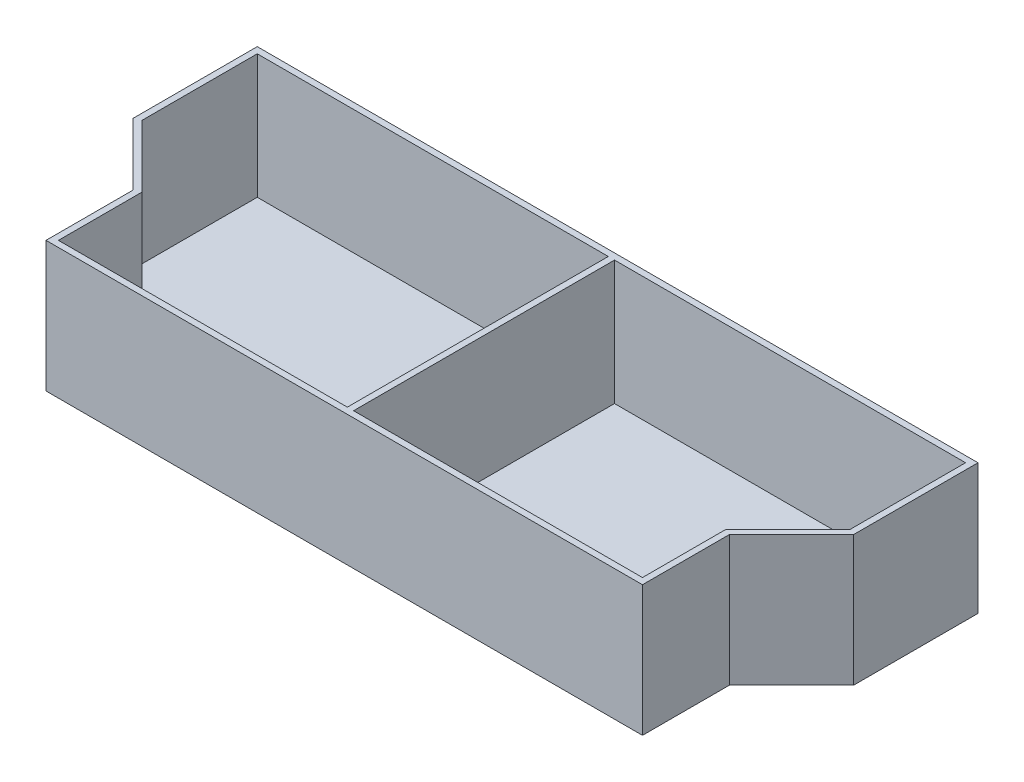
ISO-10303-21;
HEADER;
FILE_DESCRIPTION(('STEP AP214'),'2;1');
FILE_NAME('part.step','',(''),(''),'','','');
FILE_SCHEMA(('AUTOMOTIVE_DESIGN { 1 0 10303 214 1 1 1 1 }'));
ENDSEC;
DATA;
#1=APPLICATION_CONTEXT('core data for automotive mechanical design processes');
#2=APPLICATION_PROTOCOL_DEFINITION('international standard','automotive_design',2000,#1);
#3=PRODUCT_CONTEXT('',#1,'mechanical');
#4=PRODUCT('Part','Part','',(#3));
#5=PRODUCT_RELATED_PRODUCT_CATEGORY('part','',(#4));
#6=PRODUCT_DEFINITION_FORMATION('','',#4);
#7=PRODUCT_DEFINITION_CONTEXT('part definition',#1,'design');
#8=PRODUCT_DEFINITION('design','',#6,#7);
#9=PRODUCT_DEFINITION_SHAPE('','',#8);
#10=(LENGTH_UNIT() NAMED_UNIT(*) SI_UNIT(.MILLI.,.METRE.));
#11=(NAMED_UNIT(*) PLANE_ANGLE_UNIT() SI_UNIT($,.RADIAN.));
#12=(NAMED_UNIT(*) SI_UNIT($,.STERADIAN.) SOLID_ANGLE_UNIT());
#13=UNCERTAINTY_MEASURE_WITH_UNIT(LENGTH_MEASURE(1.E-05),#10,'distance_accuracy_value','');
#14=(GEOMETRIC_REPRESENTATION_CONTEXT(3) GLOBAL_UNCERTAINTY_ASSIGNED_CONTEXT((#13)) GLOBAL_UNIT_ASSIGNED_CONTEXT((#10,
#11,#12)) REPRESENTATION_CONTEXT('',''));
#15=CARTESIAN_POINT('',(0.,0.,0.));
#16=DIRECTION('',(0.,0.,1.));
#17=DIRECTION('',(1.,0.,0.));
#18=AXIS2_PLACEMENT_3D('',#15,#16,#17);
#19=CARTESIAN_POINT('',(596.9,254.,-12.7));
#20=DIRECTION('',(0.,0.,-1.));
#21=DIRECTION('',(-1.,0.,0.));
#22=AXIS2_PLACEMENT_3D('',#19,#20,#21);
#23=PLANE('',#22);
#24=DIRECTION('',(1.,0.,0.));
#25=VECTOR('',#24,1.);
#26=CARTESIAN_POINT('',(0.,254.,-12.7));
#27=LINE('',#26,#25);
#28=CARTESIAN_POINT('',(-596.9,254.,-12.6999999999999));
#29=VERTEX_POINT('',#28);
#30=CARTESIAN_POINT('',(-6.34999999999997,254.,-12.7));
#31=VERTEX_POINT('',#30);
#32=EDGE_CURVE('E55',#29,#31,#27,.T.);
#33=ORIENTED_EDGE('',*,*,#32,.T.);
#34=DIRECTION('',(0.,-1.,0.));
#35=VECTOR('',#34,1.);
#36=CARTESIAN_POINT('',(-6.34999999999995,787.55116905504,-12.7));
#37=LINE('',#36,#35);
#38=CARTESIAN_POINT('',(-6.34999999999997,0.,-12.7));
#39=VERTEX_POINT('',#38);
#40=EDGE_CURVE('E197',#31,#39,#37,.T.);
#41=ORIENTED_EDGE('',*,*,#40,.T.);
#42=DIRECTION('',(1.,0.,0.));
#43=VECTOR('',#42,1.);
#44=CARTESIAN_POINT('',(596.9,0.,-12.7));
#45=LINE('',#44,#43);
#46=CARTESIAN_POINT('',(-596.9,0.,-12.6999999999999));
#47=VERTEX_POINT('',#46);
#48=EDGE_CURVE('E257',#47,#39,#45,.T.);
#49=ORIENTED_EDGE('',*,*,#48,.F.);
#50=DIRECTION('',(0.,-1.,0.));
#51=VECTOR('',#50,1.);
#52=CARTESIAN_POINT('',(-596.9,254.,-12.6999999999999));
#53=LINE('',#52,#51);
#54=EDGE_CURVE('E281',#29,#47,#53,.T.);
#55=ORIENTED_EDGE('',*,*,#54,.F.);
#56=EDGE_LOOP('',(#33,#41,#49,#55));
#57=FACE_BOUND('',#56,.T.);
#58=ADVANCED_FACE('F32',(#57),#23,.T.);
#59=CARTESIAN_POINT('',(6.35000000000008,0.,-12.7));
#60=VERTEX_POINT('',#59);
#61=CARTESIAN_POINT('',(596.9,0.,-12.7));
#62=VERTEX_POINT('',#61);
#63=EDGE_CURVE('E256',#60,#62,#45,.T.);
#64=ORIENTED_EDGE('',*,*,#63,.F.);
#65=DIRECTION('',(0.,-1.,0.));
#66=VECTOR('',#65,1.);
#67=CARTESIAN_POINT('',(6.35000000000005,787.55116905504,-12.7));
#68=LINE('',#67,#66);
#69=CARTESIAN_POINT('',(6.35000000000008,254.,-12.7));
#70=VERTEX_POINT('',#69);
#71=EDGE_CURVE('E47',#70,#60,#68,.T.);
#72=ORIENTED_EDGE('',*,*,#71,.F.);
#73=CARTESIAN_POINT('',(596.9,254.,-12.7));
#74=VERTEX_POINT('',#73);
#75=EDGE_CURVE('E238',#70,#74,#27,.T.);
#76=ORIENTED_EDGE('',*,*,#75,.T.);
#77=DIRECTION('',(0.,-1.,0.));
#78=VECTOR('',#77,1.);
#79=CARTESIAN_POINT('',(596.9,254.,-12.7));
#80=LINE('',#79,#78);
#81=EDGE_CURVE('E278',#74,#62,#80,.T.);
#82=ORIENTED_EDGE('',*,*,#81,.T.);
#83=EDGE_LOOP('',(#64,#72,#76,#82));
#84=FACE_BOUND('',#83,.T.);
#85=ADVANCED_FACE('F367',(#84),#23,.T.);
#86=CARTESIAN_POINT('',(-723.900000000001,254.,-546.1));
#87=DIRECTION('',(0.,0.,1.));
#88=DIRECTION('',(1.,0.,0.));
#89=AXIS2_PLACEMENT_3D('',#86,#87,#88);
#90=PLANE('',#89);
#91=DIRECTION('',(-1.,0.,0.));
#92=VECTOR('',#91,1.);
#93=CARTESIAN_POINT('',(-723.900000000001,0.,-546.1));
#94=LINE('',#93,#92);
#95=CARTESIAN_POINT('',(-6.34999999999997,0.,-546.1));
#96=VERTEX_POINT('',#95);
#97=CARTESIAN_POINT('',(-723.900000000001,0.,-546.1));
#98=VERTEX_POINT('',#97);
#99=EDGE_CURVE('E181',#96,#98,#94,.T.);
#100=ORIENTED_EDGE('',*,*,#99,.F.);
#101=DIRECTION('',(0.,-1.,0.));
#102=VECTOR('',#101,1.);
#103=CARTESIAN_POINT('',(-6.34999999999991,787.55116905504,-546.1));
#104=LINE('',#103,#102);
#105=CARTESIAN_POINT('',(-6.34999999999997,254.,-546.1));
#106=VERTEX_POINT('',#105);
#107=EDGE_CURVE('E191',#106,#96,#104,.T.);
#108=ORIENTED_EDGE('',*,*,#107,.F.);
#109=DIRECTION('',(-1.,0.,0.));
#110=VECTOR('',#109,1.);
#111=CARTESIAN_POINT('',(-723.900000000001,254.,-546.1));
#112=LINE('',#111,#110);
#113=CARTESIAN_POINT('',(-723.900000000001,254.,-546.1));
#114=VERTEX_POINT('',#113);
#115=EDGE_CURVE('E246',#106,#114,#112,.T.);
#116=ORIENTED_EDGE('',*,*,#115,.T.);
#117=DIRECTION('',(0.,-1.,0.));
#118=VECTOR('',#117,1.);
#119=CARTESIAN_POINT('',(-723.900000000001,254.,-546.1));
#120=LINE('',#119,#118);
#121=EDGE_CURVE('E269',#114,#98,#120,.T.);
#122=ORIENTED_EDGE('',*,*,#121,.T.);
#123=EDGE_LOOP('',(#100,#108,#116,#122));
#124=FACE_BOUND('',#123,.T.);
#125=ADVANCED_FACE('F372',(#124),#90,.T.);
#126=CARTESIAN_POINT('',(723.9,254.,-546.1));
#127=VERTEX_POINT('',#126);
#128=CARTESIAN_POINT('',(6.35000000000008,254.,-546.1));
#129=VERTEX_POINT('',#128);
#130=EDGE_CURVE('E187',#127,#129,#112,.T.);
#131=ORIENTED_EDGE('',*,*,#130,.T.);
#132=DIRECTION('',(0.,-1.,0.));
#133=VECTOR('',#132,1.);
#134=CARTESIAN_POINT('',(6.35000000000009,787.55116905504,-546.1));
#135=LINE('',#134,#133);
#136=CARTESIAN_POINT('',(6.35000000000009,0.,-546.1));
#137=VERTEX_POINT('',#136);
#138=EDGE_CURVE('E184',#129,#137,#135,.T.);
#139=ORIENTED_EDGE('',*,*,#138,.T.);
#140=CARTESIAN_POINT('',(723.9,0.,-546.1));
#141=VERTEX_POINT('',#140);
#142=EDGE_CURVE('E170',#141,#137,#94,.T.);
#143=ORIENTED_EDGE('',*,*,#142,.F.);
#144=DIRECTION('',(0.,-1.,0.));
#145=VECTOR('',#144,1.);
#146=CARTESIAN_POINT('',(723.9,254.,-546.1));
#147=LINE('',#146,#145);
#148=EDGE_CURVE('E272',#127,#141,#147,.T.);
#149=ORIENTED_EDGE('',*,*,#148,.F.);
#150=EDGE_LOOP('',(#131,#139,#143,#149));
#151=FACE_BOUND('',#150,.T.);
#152=ADVANCED_FACE('F185',(#151),#90,.T.);
#153=CARTESIAN_POINT('',(0.,0.,0.));
#154=DIRECTION('',(0.,-1.,0.));
#155=DIRECTION('',(0.,0.,-1.));
#156=AXIS2_PLACEMENT_3D('',#153,#154,#155);
#157=PLANE('',#156);
#158=DIRECTION('',(0.,0.,1.));
#159=VECTOR('',#158,1.);
#160=CARTESIAN_POINT('',(-6.34999999999995,0.,-12.7));
#161=LINE('',#160,#159);
#162=EDGE_CURVE('E194',#96,#39,#161,.T.);
#163=ORIENTED_EDGE('',*,*,#162,.F.);
#164=ORIENTED_EDGE('',*,*,#99,.T.);
#165=DIRECTION('',(0.,0.,1.));
#166=VECTOR('',#165,1.);
#167=CARTESIAN_POINT('',(-723.900000000001,0.,-310.060512242138));
#168=LINE('',#167,#166);
#169=CARTESIAN_POINT('',(-723.900000000001,0.,-310.060512242138));
#170=VERTEX_POINT('',#169);
#171=EDGE_CURVE('E180',#98,#170,#168,.T.);
#172=ORIENTED_EDGE('',*,*,#171,.T.);
#173=DIRECTION('',(0.70710678118655,0.,0.707106781186545));
#174=VECTOR('',#173,1.);
#175=CARTESIAN_POINT('',(-596.9,0.,-183.060512242138));
#176=LINE('',#175,#174);
#177=CARTESIAN_POINT('',(-596.9,0.,-183.060512242138));
#178=VERTEX_POINT('',#177);
#179=EDGE_CURVE('E233',#170,#178,#176,.T.);
#180=ORIENTED_EDGE('',*,*,#179,.T.);
#181=DIRECTION('',(0.,0.,1.));
#182=VECTOR('',#181,1.);
#183=CARTESIAN_POINT('',(-596.9,0.,-12.6999999999999));
#184=LINE('',#183,#182);
#185=EDGE_CURVE('E253',#178,#47,#184,.T.);
#186=ORIENTED_EDGE('',*,*,#185,.T.);
#187=ORIENTED_EDGE('',*,*,#48,.T.);
#188=EDGE_LOOP('',(#163,#164,#172,#180,#186,#187));
#189=FACE_BOUND('',#188,.T.);
#190=ADVANCED_FACE('F506',(#189),#157,.F.);
#191=DIRECTION('',(0.,0.,-1.));
#192=VECTOR('',#191,1.);
#193=CARTESIAN_POINT('',(6.35000000000005,0.,-12.7));
#194=LINE('',#193,#192);
#195=EDGE_CURVE('E174',#60,#137,#194,.T.);
#196=ORIENTED_EDGE('',*,*,#195,.F.);
#197=ORIENTED_EDGE('',*,*,#63,.T.);
#198=DIRECTION('',(0.,0.,-1.));
#199=VECTOR('',#198,1.);
#200=CARTESIAN_POINT('',(596.9,0.,-183.060512242138));
#201=LINE('',#200,#199);
#202=CARTESIAN_POINT('',(596.9,0.,-183.060512242138));
#203=VERTEX_POINT('',#202);
#204=EDGE_CURVE('E260',#62,#203,#201,.T.);
#205=ORIENTED_EDGE('',*,*,#204,.T.);
#206=DIRECTION('',(0.707106781186545,0.,-0.70710678118655));
#207=VECTOR('',#206,1.);
#208=CARTESIAN_POINT('',(723.9,0.,-310.060512242138));
#209=LINE('',#208,#207);
#210=CARTESIAN_POINT('',(723.9,0.,-310.060512242138));
#211=VERTEX_POINT('',#210);
#212=EDGE_CURVE('E263',#203,#211,#209,.T.);
#213=ORIENTED_EDGE('',*,*,#212,.T.);
#214=DIRECTION('',(0.,0.,-1.));
#215=VECTOR('',#214,1.);
#216=CARTESIAN_POINT('',(723.9,0.,-546.1));
#217=LINE('',#216,#215);
#218=EDGE_CURVE('E177',#211,#141,#217,.T.);
#219=ORIENTED_EDGE('',*,*,#218,.T.);
#220=ORIENTED_EDGE('',*,*,#142,.T.);
#221=EDGE_LOOP('',(#196,#197,#205,#213,#219,#220));
#222=FACE_BOUND('',#221,.T.);
#223=ADVANCED_FACE('F172',(#222),#157,.F.);
#224=CARTESIAN_POINT('',(0.,254.,0.));
#225=DIRECTION('',(0.,-1.,0.));
#226=DIRECTION('',(0.,0.,-1.));
#227=AXIS2_PLACEMENT_3D('',#224,#225,#226);
#228=PLANE('',#227);
#229=DIRECTION('',(0.,0.,-1.));
#230=VECTOR('',#229,1.);
#231=CARTESIAN_POINT('',(-6.34999999999995,254.,-12.7));
#232=LINE('',#231,#230);
#233=EDGE_CURVE('E206',#31,#106,#232,.T.);
#234=ORIENTED_EDGE('',*,*,#233,.F.);
#235=ORIENTED_EDGE('',*,*,#32,.F.);
#236=DIRECTION('',(0.,0.,1.));
#237=VECTOR('',#236,1.);
#238=CARTESIAN_POINT('',(-596.9,254.,-12.6999999999999));
#239=LINE('',#238,#237);
#240=CARTESIAN_POINT('',(-596.9,254.,-183.060512242138));
#241=VERTEX_POINT('',#240);
#242=EDGE_CURVE('E236',#241,#29,#239,.T.);
#243=ORIENTED_EDGE('',*,*,#242,.F.);
#244=DIRECTION('',(0.70710678118655,0.,0.707106781186545));
#245=VECTOR('',#244,1.);
#246=CARTESIAN_POINT('',(-596.9,254.,-183.060512242138));
#247=LINE('',#246,#245);
#248=CARTESIAN_POINT('',(-723.900000000001,254.,-310.060512242138));
#249=VERTEX_POINT('',#248);
#250=EDGE_CURVE('E234',#249,#241,#247,.T.);
#251=ORIENTED_EDGE('',*,*,#250,.F.);
#252=DIRECTION('',(0.,0.,1.));
#253=VECTOR('',#252,1.);
#254=CARTESIAN_POINT('',(-723.900000000001,254.,-310.060512242138));
#255=LINE('',#254,#253);
#256=EDGE_CURVE('E248',#114,#249,#255,.T.);
#257=ORIENTED_EDGE('',*,*,#256,.F.);
#258=ORIENTED_EDGE('',*,*,#115,.F.);
#259=EDGE_LOOP('',(#234,#235,#243,#251,#257,#258));
#260=FACE_BOUND('',#259,.T.);
#261=DIRECTION('',(1.,0.,0.));
#262=VECTOR('',#261,1.);
#263=CARTESIAN_POINT('',(609.6,254.,0.));
#264=LINE('',#263,#262);
#265=CARTESIAN_POINT('',(-609.6,254.,0.));
#266=VERTEX_POINT('',#265);
#267=CARTESIAN_POINT('',(609.6,254.,0.));
#268=VERTEX_POINT('',#267);
#269=EDGE_CURVE('E287',#266,#268,#264,.T.);
#270=ORIENTED_EDGE('',*,*,#269,.T.);
#271=DIRECTION('',(0.,0.,-1.));
#272=VECTOR('',#271,1.);
#273=CARTESIAN_POINT('',(609.6,254.,-177.799999999999));
#274=LINE('',#273,#272);
#275=CARTESIAN_POINT('',(609.6,254.,-177.799999999999));
#276=VERTEX_POINT('',#275);
#277=EDGE_CURVE('E290',#268,#276,#274,.T.);
#278=ORIENTED_EDGE('',*,*,#277,.T.);
#279=DIRECTION('',(0.707106781186545,0.,-0.70710678118655));
#280=VECTOR('',#279,1.);
#281=CARTESIAN_POINT('',(736.599999999999,254.,-304.8));
#282=LINE('',#281,#280);
#283=CARTESIAN_POINT('',(736.599999999999,254.,-304.8));
#284=VERTEX_POINT('',#283);
#285=EDGE_CURVE('E292',#276,#284,#282,.T.);
#286=ORIENTED_EDGE('',*,*,#285,.T.);
#287=DIRECTION('',(0.,0.,-1.));
#288=VECTOR('',#287,1.);
#289=CARTESIAN_POINT('',(736.6,254.,-558.8));
#290=LINE('',#289,#288);
#291=CARTESIAN_POINT('',(736.6,254.,-558.8));
#292=VERTEX_POINT('',#291);
#293=EDGE_CURVE('E294',#284,#292,#290,.T.);
#294=ORIENTED_EDGE('',*,*,#293,.T.);
#295=DIRECTION('',(-1.,0.,0.));
#296=VECTOR('',#295,1.);
#297=CARTESIAN_POINT('',(-736.600000000001,254.,-558.8));
#298=LINE('',#297,#296);
#299=CARTESIAN_POINT('',(-736.600000000001,254.,-558.8));
#300=VERTEX_POINT('',#299);
#301=EDGE_CURVE('E296',#292,#300,#298,.T.);
#302=ORIENTED_EDGE('',*,*,#301,.T.);
#303=DIRECTION('',(0.,0.,1.));
#304=VECTOR('',#303,1.);
#305=CARTESIAN_POINT('',(-736.600000000001,254.,-304.799999999999));
#306=LINE('',#305,#304);
#307=CARTESIAN_POINT('',(-736.600000000001,254.,-304.799999999999));
#308=VERTEX_POINT('',#307);
#309=EDGE_CURVE('E298',#300,#308,#306,.T.);
#310=ORIENTED_EDGE('',*,*,#309,.T.);
#311=DIRECTION('',(0.707106781186551,0.,0.707106781186544));
#312=VECTOR('',#311,1.);
#313=CARTESIAN_POINT('',(-609.6,254.,-177.8));
#314=LINE('',#313,#312);
#315=CARTESIAN_POINT('',(-609.6,254.,-177.8));
#316=VERTEX_POINT('',#315);
#317=EDGE_CURVE('E300',#308,#316,#314,.T.);
#318=ORIENTED_EDGE('',*,*,#317,.T.);
#319=DIRECTION('',(0.,0.,1.));
#320=VECTOR('',#319,1.);
#321=CARTESIAN_POINT('',(-609.6,254.,0.));
#322=LINE('',#321,#320);
#323=EDGE_CURVE('E302',#316,#266,#322,.T.);
#324=ORIENTED_EDGE('',*,*,#323,.T.);
#325=EDGE_LOOP('',(#270,#278,#286,#294,#302,#310,#318,#324));
#326=FACE_BOUND('',#325,.T.);
#327=ORIENTED_EDGE('',*,*,#75,.F.);
#328=DIRECTION('',(0.,0.,1.));
#329=VECTOR('',#328,1.);
#330=CARTESIAN_POINT('',(6.35000000000005,254.,-12.7));
#331=LINE('',#330,#329);
#332=EDGE_CURVE('E200',#129,#70,#331,.T.);
#333=ORIENTED_EDGE('',*,*,#332,.F.);
#334=ORIENTED_EDGE('',*,*,#130,.F.);
#335=DIRECTION('',(0.,0.,-1.));
#336=VECTOR('',#335,1.);
#337=CARTESIAN_POINT('',(723.9,254.,-546.1));
#338=LINE('',#337,#336);
#339=CARTESIAN_POINT('',(723.9,254.,-310.060512242138));
#340=VERTEX_POINT('',#339);
#341=EDGE_CURVE('E244',#340,#127,#338,.T.);
#342=ORIENTED_EDGE('',*,*,#341,.F.);
#343=DIRECTION('',(0.707106781186545,0.,-0.70710678118655));
#344=VECTOR('',#343,1.);
#345=CARTESIAN_POINT('',(723.9,254.,-310.060512242138));
#346=LINE('',#345,#344);
#347=CARTESIAN_POINT('',(596.9,254.,-183.060512242138));
#348=VERTEX_POINT('',#347);
#349=EDGE_CURVE('E242',#348,#340,#346,.T.);
#350=ORIENTED_EDGE('',*,*,#349,.F.);
#351=DIRECTION('',(0.,0.,-1.));
#352=VECTOR('',#351,1.);
#353=CARTESIAN_POINT('',(596.9,254.,-183.060512242138));
#354=LINE('',#353,#352);
#355=EDGE_CURVE('E240',#74,#348,#354,.T.);
#356=ORIENTED_EDGE('',*,*,#355,.F.);
#357=EDGE_LOOP('',(#327,#333,#334,#342,#350,#356));
#358=FACE_BOUND('',#357,.T.);
#359=ADVANCED_FACE('F336',(#260,#326,#358),#228,.F.);
#360=CARTESIAN_POINT('',(609.6,254.,-177.799999999999));
#361=DIRECTION('',(-1.,0.,0.));
#362=DIRECTION('',(0.,0.,1.));
#363=AXIS2_PLACEMENT_3D('',#360,#361,#362);
#364=PLANE('',#363);
#365=DIRECTION('',(0.,-1.,0.));
#366=VECTOR('',#365,1.);
#367=CARTESIAN_POINT('',(609.6,254.,0.));
#368=LINE('',#367,#366);
#369=CARTESIAN_POINT('',(609.6,-12.7,0.));
#370=VERTEX_POINT('',#369);
#371=EDGE_CURVE('E11',#268,#370,#368,.T.);
#372=ORIENTED_EDGE('',*,*,#371,.T.);
#373=DIRECTION('',(0.,0.,1.));
#374=VECTOR('',#373,1.);
#375=CARTESIAN_POINT('',(609.6,-12.7,-177.799999999999));
#376=LINE('',#375,#374);
#377=CARTESIAN_POINT('',(609.6,-12.7,-177.799999999999));
#378=VERTEX_POINT('',#377);
#379=EDGE_CURVE('E212',#378,#370,#376,.T.);
#380=ORIENTED_EDGE('',*,*,#379,.F.);
#381=DIRECTION('',(0.,-1.,0.));
#382=VECTOR('',#381,1.);
#383=CARTESIAN_POINT('',(609.6,254.,-177.799999999999));
#384=LINE('',#383,#382);
#385=EDGE_CURVE('E40',#276,#378,#384,.T.);
#386=ORIENTED_EDGE('',*,*,#385,.F.);
#387=ORIENTED_EDGE('',*,*,#277,.F.);
#388=EDGE_LOOP('',(#372,#380,#386,#387));
#389=FACE_BOUND('',#388,.T.);
#390=ADVANCED_FACE('F34',(#389),#364,.F.);
#391=CARTESIAN_POINT('',(736.599999999999,254.,-304.8));
#392=DIRECTION('',(-0.70710678118655,0.,-0.707106781186545));
#393=DIRECTION('',(-0.707106781186545,0.,0.70710678118655));
#394=AXIS2_PLACEMENT_3D('',#391,#392,#393);
#395=PLANE('',#394);
#396=ORIENTED_EDGE('',*,*,#385,.T.);
#397=DIRECTION('',(-0.707106781186545,0.,0.70710678118655));
#398=VECTOR('',#397,1.);
#399=CARTESIAN_POINT('',(736.599999999999,-12.7,-304.8));
#400=LINE('',#399,#398);
#401=CARTESIAN_POINT('',(736.599999999999,-12.7,-304.8));
#402=VERTEX_POINT('',#401);
#403=EDGE_CURVE('E209',#402,#378,#400,.T.);
#404=ORIENTED_EDGE('',*,*,#403,.F.);
#405=DIRECTION('',(0.,-1.,0.));
#406=VECTOR('',#405,1.);
#407=CARTESIAN_POINT('',(736.599999999999,254.,-304.8));
#408=LINE('',#407,#406);
#409=EDGE_CURVE('E315',#284,#402,#408,.T.);
#410=ORIENTED_EDGE('',*,*,#409,.F.);
#411=ORIENTED_EDGE('',*,*,#285,.F.);
#412=EDGE_LOOP('',(#396,#404,#410,#411));
#413=FACE_BOUND('',#412,.T.);
#414=ADVANCED_FACE('F321',(#413),#395,.F.);
#415=CARTESIAN_POINT('',(736.6,254.,-558.8));
#416=DIRECTION('',(-1.,0.,0.));
#417=DIRECTION('',(0.,0.,1.));
#418=AXIS2_PLACEMENT_3D('',#415,#416,#417);
#419=PLANE('',#418);
#420=ORIENTED_EDGE('',*,*,#409,.T.);
#421=DIRECTION('',(0.,0.,1.));
#422=VECTOR('',#421,1.);
#423=CARTESIAN_POINT('',(736.6,-12.7,-558.8));
#424=LINE('',#423,#422);
#425=CARTESIAN_POINT('',(736.6,-12.7,-558.8));
#426=VERTEX_POINT('',#425);
#427=EDGE_CURVE('E230',#426,#402,#424,.T.);
#428=ORIENTED_EDGE('',*,*,#427,.F.);
#429=DIRECTION('',(0.,-1.,0.));
#430=VECTOR('',#429,1.);
#431=CARTESIAN_POINT('',(736.6,254.,-558.8));
#432=LINE('',#431,#430);
#433=EDGE_CURVE('E313',#292,#426,#432,.T.);
#434=ORIENTED_EDGE('',*,*,#433,.F.);
#435=ORIENTED_EDGE('',*,*,#293,.F.);
#436=EDGE_LOOP('',(#420,#428,#434,#435));
#437=FACE_BOUND('',#436,.T.);
#438=ADVANCED_FACE('F332',(#437),#419,.F.);
#439=CARTESIAN_POINT('',(-736.600000000001,254.,-558.8));
#440=DIRECTION('',(0.,0.,1.));
#441=DIRECTION('',(1.,0.,0.));
#442=AXIS2_PLACEMENT_3D('',#439,#440,#441);
#443=PLANE('',#442);
#444=ORIENTED_EDGE('',*,*,#433,.T.);
#445=DIRECTION('',(1.,0.,0.));
#446=VECTOR('',#445,1.);
#447=CARTESIAN_POINT('',(-736.600000000001,-12.7,-558.8));
#448=LINE('',#447,#446);
#449=CARTESIAN_POINT('',(-736.600000000001,-12.7,-558.8));
#450=VERTEX_POINT('',#449);
#451=EDGE_CURVE('E227',#450,#426,#448,.T.);
#452=ORIENTED_EDGE('',*,*,#451,.F.);
#453=DIRECTION('',(0.,-1.,0.));
#454=VECTOR('',#453,1.);
#455=CARTESIAN_POINT('',(-736.600000000001,254.,-558.8));
#456=LINE('',#455,#454);
#457=EDGE_CURVE('E311',#300,#450,#456,.T.);
#458=ORIENTED_EDGE('',*,*,#457,.F.);
#459=ORIENTED_EDGE('',*,*,#301,.F.);
#460=EDGE_LOOP('',(#444,#452,#458,#459));
#461=FACE_BOUND('',#460,.T.);
#462=ADVANCED_FACE('F357',(#461),#443,.F.);
#463=CARTESIAN_POINT('',(-736.600000000001,254.,-304.799999999999));
#464=DIRECTION('',(1.,0.,0.));
#465=DIRECTION('',(0.,0.,-1.));
#466=AXIS2_PLACEMENT_3D('',#463,#464,#465);
#467=PLANE('',#466);
#468=ORIENTED_EDGE('',*,*,#457,.T.);
#469=DIRECTION('',(0.,0.,-1.));
#470=VECTOR('',#469,1.);
#471=CARTESIAN_POINT('',(-736.600000000001,-12.7,-304.799999999999));
#472=LINE('',#471,#470);
#473=CARTESIAN_POINT('',(-736.600000000001,-12.7,-304.799999999999));
#474=VERTEX_POINT('',#473);
#475=EDGE_CURVE('E224',#474,#450,#472,.T.);
#476=ORIENTED_EDGE('',*,*,#475,.F.);
#477=DIRECTION('',(0.,-1.,0.));
#478=VECTOR('',#477,1.);
#479=CARTESIAN_POINT('',(-736.600000000001,254.,-304.799999999999));
#480=LINE('',#479,#478);
#481=EDGE_CURVE('E309',#308,#474,#480,.T.);
#482=ORIENTED_EDGE('',*,*,#481,.F.);
#483=ORIENTED_EDGE('',*,*,#309,.F.);
#484=EDGE_LOOP('',(#468,#476,#482,#483));
#485=FACE_BOUND('',#484,.T.);
#486=ADVANCED_FACE('F354',(#485),#467,.F.);
#487=CARTESIAN_POINT('',(-609.6,254.,-177.8));
#488=DIRECTION('',(0.707106781186544,0.,-0.707106781186551));
#489=DIRECTION('',(-0.707106781186551,0.,-0.707106781186544));
#490=AXIS2_PLACEMENT_3D('',#487,#488,#489);
#491=PLANE('',#490);
#492=ORIENTED_EDGE('',*,*,#481,.T.);
#493=DIRECTION('',(-0.707106781186551,0.,-0.707106781186544));
#494=VECTOR('',#493,1.);
#495=CARTESIAN_POINT('',(-609.6,-12.7,-177.8));
#496=LINE('',#495,#494);
#497=CARTESIAN_POINT('',(-609.6,-12.7,-177.8));
#498=VERTEX_POINT('',#497);
#499=EDGE_CURVE('E221',#498,#474,#496,.T.);
#500=ORIENTED_EDGE('',*,*,#499,.F.);
#501=DIRECTION('',(0.,-1.,0.));
#502=VECTOR('',#501,1.);
#503=CARTESIAN_POINT('',(-609.6,254.,-177.8));
#504=LINE('',#503,#502);
#505=EDGE_CURVE('E307',#316,#498,#504,.T.);
#506=ORIENTED_EDGE('',*,*,#505,.F.);
#507=ORIENTED_EDGE('',*,*,#317,.F.);
#508=EDGE_LOOP('',(#492,#500,#506,#507));
#509=FACE_BOUND('',#508,.T.);
#510=ADVANCED_FACE('F350',(#509),#491,.F.);
#511=CARTESIAN_POINT('',(-609.6,254.,0.));
#512=DIRECTION('',(1.,0.,0.));
#513=DIRECTION('',(0.,0.,-1.));
#514=AXIS2_PLACEMENT_3D('',#511,#512,#513);
#515=PLANE('',#514);
#516=ORIENTED_EDGE('',*,*,#505,.T.);
#517=DIRECTION('',(0.,0.,-1.));
#518=VECTOR('',#517,1.);
#519=CARTESIAN_POINT('',(-609.6,-12.7,0.));
#520=LINE('',#519,#518);
#521=CARTESIAN_POINT('',(-609.6,-12.7,0.));
#522=VERTEX_POINT('',#521);
#523=EDGE_CURVE('E218',#522,#498,#520,.T.);
#524=ORIENTED_EDGE('',*,*,#523,.F.);
#525=DIRECTION('',(0.,-1.,0.));
#526=VECTOR('',#525,1.);
#527=CARTESIAN_POINT('',(-609.6,254.,0.));
#528=LINE('',#527,#526);
#529=EDGE_CURVE('E305',#266,#522,#528,.T.);
#530=ORIENTED_EDGE('',*,*,#529,.F.);
#531=ORIENTED_EDGE('',*,*,#323,.F.);
#532=EDGE_LOOP('',(#516,#524,#530,#531));
#533=FACE_BOUND('',#532,.T.);
#534=ADVANCED_FACE('F346',(#533),#515,.F.);
#535=CARTESIAN_POINT('',(0.,254.,0.));
#536=DIRECTION('',(0.,0.,-1.));
#537=DIRECTION('',(-1.,0.,0.));
#538=AXIS2_PLACEMENT_3D('',#535,#536,#537);
#539=PLANE('',#538);
#540=ORIENTED_EDGE('',*,*,#529,.T.);
#541=DIRECTION('',(-1.,0.,0.));
#542=VECTOR('',#541,1.);
#543=CARTESIAN_POINT('',(609.6,-12.7,0.));
#544=LINE('',#543,#542);
#545=EDGE_CURVE('E215',#370,#522,#544,.T.);
#546=ORIENTED_EDGE('',*,*,#545,.F.);
#547=ORIENTED_EDGE('',*,*,#371,.F.);
#548=ORIENTED_EDGE('',*,*,#269,.F.);
#549=EDGE_LOOP('',(#540,#546,#547,#548));
#550=FACE_BOUND('',#549,.T.);
#551=ADVANCED_FACE('F342',(#550),#539,.F.);
#552=CARTESIAN_POINT('',(-596.9,254.,-183.060512242138));
#553=DIRECTION('',(0.707106781186545,0.,-0.70710678118655));
#554=DIRECTION('',(-0.70710678118655,0.,-0.707106781186545));
#555=AXIS2_PLACEMENT_3D('',#552,#553,#554);
#556=PLANE('',#555);
#557=ORIENTED_EDGE('',*,*,#179,.F.);
#558=DIRECTION('',(0.,-1.,0.));
#559=VECTOR('',#558,1.);
#560=CARTESIAN_POINT('',(-723.900000000001,254.,-310.060512242138));
#561=LINE('',#560,#559);
#562=EDGE_CURVE('E250',#249,#170,#561,.T.);
#563=ORIENTED_EDGE('',*,*,#562,.F.);
#564=ORIENTED_EDGE('',*,*,#250,.T.);
#565=DIRECTION('',(0.,-1.,0.));
#566=VECTOR('',#565,1.);
#567=CARTESIAN_POINT('',(-596.9,254.,-183.060512242138));
#568=LINE('',#567,#566);
#569=EDGE_CURVE('E284',#241,#178,#568,.T.);
#570=ORIENTED_EDGE('',*,*,#569,.T.);
#571=EDGE_LOOP('',(#557,#563,#564,#570));
#572=FACE_BOUND('',#571,.T.);
#573=ADVANCED_FACE('F380',(#572),#556,.T.);
#574=CARTESIAN_POINT('',(-596.9,254.,-12.6999999999999));
#575=DIRECTION('',(1.,0.,0.));
#576=DIRECTION('',(0.,0.,-1.));
#577=AXIS2_PLACEMENT_3D('',#574,#575,#576);
#578=PLANE('',#577);
#579=ORIENTED_EDGE('',*,*,#185,.F.);
#580=ORIENTED_EDGE('',*,*,#569,.F.);
#581=ORIENTED_EDGE('',*,*,#242,.T.);
#582=ORIENTED_EDGE('',*,*,#54,.T.);
#583=EDGE_LOOP('',(#579,#580,#581,#582));
#584=FACE_BOUND('',#583,.T.);
#585=ADVANCED_FACE('F377',(#584),#578,.T.);
#586=CARTESIAN_POINT('',(596.9,254.,-183.060512242138));
#587=DIRECTION('',(-1.,0.,0.));
#588=DIRECTION('',(0.,0.,1.));
#589=AXIS2_PLACEMENT_3D('',#586,#587,#588);
#590=PLANE('',#589);
#591=ORIENTED_EDGE('',*,*,#204,.F.);
#592=ORIENTED_EDGE('',*,*,#81,.F.);
#593=ORIENTED_EDGE('',*,*,#355,.T.);
#594=DIRECTION('',(0.,-1.,0.));
#595=VECTOR('',#594,1.);
#596=CARTESIAN_POINT('',(596.9,254.,-183.060512242138));
#597=LINE('',#596,#595);
#598=EDGE_CURVE('E276',#348,#203,#597,.T.);
#599=ORIENTED_EDGE('',*,*,#598,.T.);
#600=EDGE_LOOP('',(#591,#592,#593,#599));
#601=FACE_BOUND('',#600,.T.);
#602=ADVANCED_FACE('F375',(#601),#590,.T.);
#603=CARTESIAN_POINT('',(723.9,254.,-310.060512242138));
#604=DIRECTION('',(-0.70710678118655,0.,-0.707106781186545));
#605=DIRECTION('',(-0.707106781186545,0.,0.70710678118655));
#606=AXIS2_PLACEMENT_3D('',#603,#604,#605);
#607=PLANE('',#606);
#608=ORIENTED_EDGE('',*,*,#212,.F.);
#609=ORIENTED_EDGE('',*,*,#598,.F.);
#610=ORIENTED_EDGE('',*,*,#349,.T.);
#611=DIRECTION('',(0.,-1.,0.));
#612=VECTOR('',#611,1.);
#613=CARTESIAN_POINT('',(723.9,254.,-310.060512242138));
#614=LINE('',#613,#612);
#615=EDGE_CURVE('E274',#340,#211,#614,.T.);
#616=ORIENTED_EDGE('',*,*,#615,.T.);
#617=EDGE_LOOP('',(#608,#609,#610,#616));
#618=FACE_BOUND('',#617,.T.);
#619=ADVANCED_FACE('F419',(#618),#607,.T.);
#620=CARTESIAN_POINT('',(723.9,254.,-546.1));
#621=DIRECTION('',(-1.,0.,0.));
#622=DIRECTION('',(0.,0.,1.));
#623=AXIS2_PLACEMENT_3D('',#620,#621,#622);
#624=PLANE('',#623);
#625=ORIENTED_EDGE('',*,*,#218,.F.);
#626=ORIENTED_EDGE('',*,*,#615,.F.);
#627=ORIENTED_EDGE('',*,*,#341,.T.);
#628=ORIENTED_EDGE('',*,*,#148,.T.);
#629=EDGE_LOOP('',(#625,#626,#627,#628));
#630=FACE_BOUND('',#629,.T.);
#631=ADVANCED_FACE('F426',(#630),#624,.T.);
#632=CARTESIAN_POINT('',(-723.900000000001,254.,-310.060512242138));
#633=DIRECTION('',(1.,0.,0.));
#634=DIRECTION('',(0.,0.,-1.));
#635=AXIS2_PLACEMENT_3D('',#632,#633,#634);
#636=PLANE('',#635);
#637=ORIENTED_EDGE('',*,*,#171,.F.);
#638=ORIENTED_EDGE('',*,*,#121,.F.);
#639=ORIENTED_EDGE('',*,*,#256,.T.);
#640=ORIENTED_EDGE('',*,*,#562,.T.);
#641=EDGE_LOOP('',(#637,#638,#639,#640));
#642=FACE_BOUND('',#641,.T.);
#643=ADVANCED_FACE('F433',(#642),#636,.T.);
#644=CARTESIAN_POINT('',(0.,-12.7,0.));
#645=DIRECTION('',(0.,-1.,0.));
#646=DIRECTION('',(0.,0.,-1.));
#647=AXIS2_PLACEMENT_3D('',#644,#645,#646);
#648=PLANE('',#647);
#649=ORIENTED_EDGE('',*,*,#403,.T.);
#650=ORIENTED_EDGE('',*,*,#379,.T.);
#651=ORIENTED_EDGE('',*,*,#545,.T.);
#652=ORIENTED_EDGE('',*,*,#523,.T.);
#653=ORIENTED_EDGE('',*,*,#499,.T.);
#654=ORIENTED_EDGE('',*,*,#475,.T.);
#655=ORIENTED_EDGE('',*,*,#451,.T.);
#656=ORIENTED_EDGE('',*,*,#427,.T.);
#657=EDGE_LOOP('',(#649,#650,#651,#652,#653,#654,#655,#656));
#658=FACE_BOUND('',#657,.T.);
#659=ADVANCED_FACE('F327',(#658),#648,.T.);
#660=CARTESIAN_POINT('',(-6.34999999999995,787.55116905504,-12.7));
#661=DIRECTION('',(1.,0.,0.));
#662=DIRECTION('',(0.,0.,-1.));
#663=AXIS2_PLACEMENT_3D('',#660,#661,#662);
#664=PLANE('',#663);
#665=ORIENTED_EDGE('',*,*,#40,.F.);
#666=ORIENTED_EDGE('',*,*,#233,.T.);
#667=ORIENTED_EDGE('',*,*,#107,.T.);
#668=ORIENTED_EDGE('',*,*,#162,.T.);
#669=EDGE_LOOP('',(#665,#666,#667,#668));
#670=FACE_BOUND('',#669,.T.);
#671=ADVANCED_FACE('F448',(#670),#664,.F.);
#672=CARTESIAN_POINT('',(6.35000000000005,787.55116905504,-12.7));
#673=DIRECTION('',(-1.,0.,0.));
#674=DIRECTION('',(0.,0.,1.));
#675=AXIS2_PLACEMENT_3D('',#672,#673,#674);
#676=PLANE('',#675);
#677=ORIENTED_EDGE('',*,*,#138,.F.);
#678=ORIENTED_EDGE('',*,*,#332,.T.);
#679=ORIENTED_EDGE('',*,*,#71,.T.);
#680=ORIENTED_EDGE('',*,*,#195,.T.);
#681=EDGE_LOOP('',(#677,#678,#679,#680));
#682=FACE_BOUND('',#681,.T.);
#683=ADVANCED_FACE('F193',(#682),#676,.F.);
#684=CLOSED_SHELL('',(#58,#85,#125,#152,#190,#223,#359,#390,#414,#438,#462,#486,#510,#534,#551,
#573,#585,#602,#619,#631,#643,#659,#671,#683));
#685=MANIFOLD_SOLID_BREP('B2',#684);
#686=ADVANCED_BREP_SHAPE_REPRESENTATION('',(#18,#685),#14);
#687=SHAPE_DEFINITION_REPRESENTATION(#9,#686);
ENDSEC;
END-ISO-10303-21;
